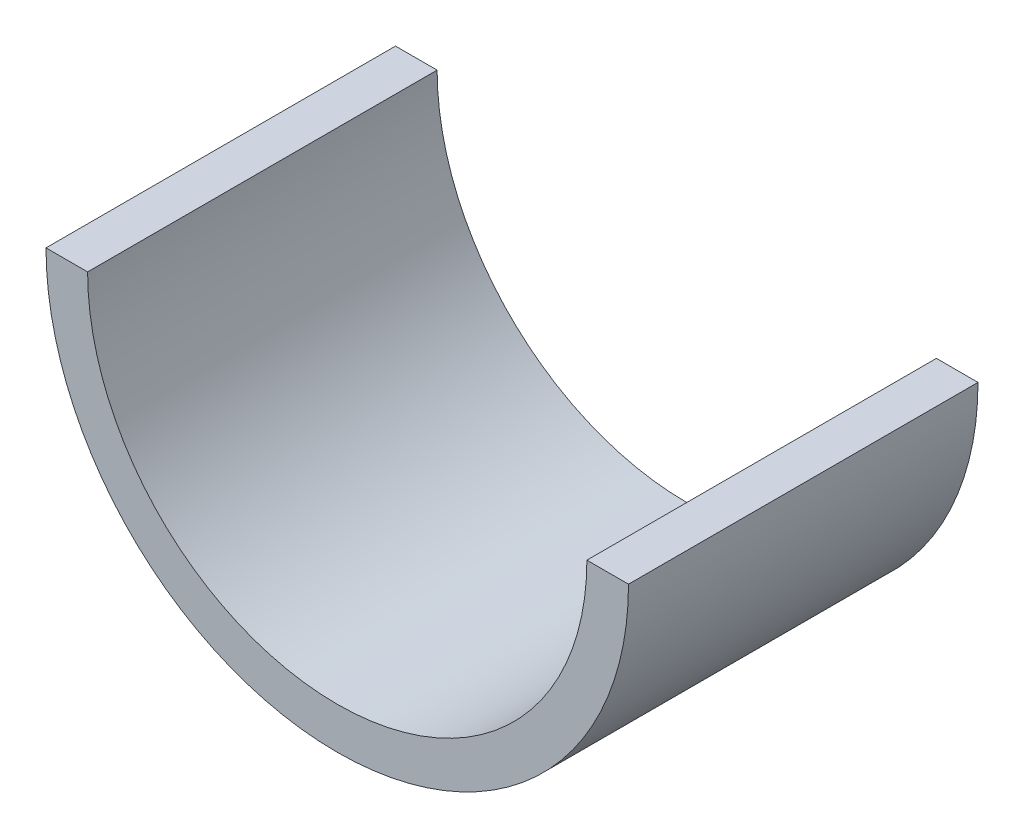
ISO-10303-21;
HEADER;
FILE_DESCRIPTION(('STEP AP214'),'2;1');
FILE_NAME('part.step','',(''),(''),'','','');
FILE_SCHEMA(('AUTOMOTIVE_DESIGN { 1 0 10303 214 1 1 1 1 }'));
ENDSEC;
DATA;
#1=APPLICATION_CONTEXT('core data for automotive mechanical design processes');
#2=APPLICATION_PROTOCOL_DEFINITION('international standard','automotive_design',2000,#1);
#3=PRODUCT_CONTEXT('',#1,'mechanical');
#4=PRODUCT('Part','Part','',(#3));
#5=PRODUCT_RELATED_PRODUCT_CATEGORY('part','',(#4));
#6=PRODUCT_DEFINITION_FORMATION('','',#4);
#7=PRODUCT_DEFINITION_CONTEXT('part definition',#1,'design');
#8=PRODUCT_DEFINITION('design','',#6,#7);
#9=PRODUCT_DEFINITION_SHAPE('','',#8);
#10=(LENGTH_UNIT() NAMED_UNIT(*) SI_UNIT(.MILLI.,.METRE.));
#11=(NAMED_UNIT(*) PLANE_ANGLE_UNIT() SI_UNIT($,.RADIAN.));
#12=(NAMED_UNIT(*) SI_UNIT($,.STERADIAN.) SOLID_ANGLE_UNIT());
#13=UNCERTAINTY_MEASURE_WITH_UNIT(LENGTH_MEASURE(1.E-05),#10,'distance_accuracy_value','');
#14=(GEOMETRIC_REPRESENTATION_CONTEXT(3) GLOBAL_UNCERTAINTY_ASSIGNED_CONTEXT((#13)) GLOBAL_UNIT_ASSIGNED_CONTEXT((#10,
#11,#12)) REPRESENTATION_CONTEXT('',''));
#15=CARTESIAN_POINT('',(0.,0.,0.));
#16=DIRECTION('',(0.,0.,1.));
#17=DIRECTION('',(1.,0.,0.));
#18=AXIS2_PLACEMENT_3D('',#15,#16,#17);
#19=CARTESIAN_POINT('',(0.,0.,42.));
#20=DIRECTION('',(0.,1.,0.));
#21=DIRECTION('',(0.,0.,1.));
#22=AXIS2_PLACEMENT_3D('',#19,#20,#21);
#23=PLANE('',#22);
#24=DIRECTION('',(1.,0.,0.));
#25=VECTOR('',#24,1.);
#26=CARTESIAN_POINT('',(0.,0.,0.));
#27=LINE('',#26,#25);
#28=CARTESIAN_POINT('',(-35.,0.,0.));
#29=VERTEX_POINT('',#28);
#30=CARTESIAN_POINT('',(-30.,0.,0.));
#31=VERTEX_POINT('',#30);
#32=EDGE_CURVE('E108',#29,#31,#27,.T.);
#33=ORIENTED_EDGE('',*,*,#32,.F.);
#34=DIRECTION('',(0.,0.,-1.));
#35=VECTOR('',#34,1.);
#36=CARTESIAN_POINT('',(-35.,0.,42.));
#37=LINE('',#36,#35);
#38=CARTESIAN_POINT('',(-35.,0.,42.));
#39=VERTEX_POINT('',#38);
#40=EDGE_CURVE('E11',#39,#29,#37,.T.);
#41=ORIENTED_EDGE('',*,*,#40,.F.);
#42=DIRECTION('',(1.,0.,0.));
#43=VECTOR('',#42,1.);
#44=CARTESIAN_POINT('',(0.,0.,42.));
#45=LINE('',#44,#43);
#46=CARTESIAN_POINT('',(-30.,0.,42.));
#47=VERTEX_POINT('',#46);
#48=EDGE_CURVE('E90',#39,#47,#45,.T.);
#49=ORIENTED_EDGE('',*,*,#48,.T.);
#50=DIRECTION('',(0.,0.,-1.));
#51=VECTOR('',#50,1.);
#52=CARTESIAN_POINT('',(-30.,0.,42.));
#53=LINE('',#52,#51);
#54=EDGE_CURVE('E58',#47,#31,#53,.T.);
#55=ORIENTED_EDGE('',*,*,#54,.T.);
#56=EDGE_LOOP('',(#33,#41,#49,#55));
#57=FACE_BOUND('',#56,.T.);
#58=ADVANCED_FACE('F41',(#57),#23,.T.);
#59=CARTESIAN_POINT('',(0.,0.,42.));
#60=DIRECTION('',(0.,0.,-1.));
#61=DIRECTION('',(-1.,0.,0.));
#62=AXIS2_PLACEMENT_3D('',#59,#60,#61);
#63=CYLINDRICAL_SURFACE('',#62,35.);
#64=CARTESIAN_POINT('',(0.,0.,0.));
#65=DIRECTION('',(0.,0.,1.));
#66=DIRECTION('',(1.,0.,0.));
#67=AXIS2_PLACEMENT_3D('',#64,#65,#66);
#68=CIRCLE('',#67,35.);
#69=CARTESIAN_POINT('',(35.,0.,0.));
#70=VERTEX_POINT('',#69);
#71=EDGE_CURVE('E95',#29,#70,#68,.T.);
#72=ORIENTED_EDGE('',*,*,#71,.T.);
#73=DIRECTION('',(0.,0.,-1.));
#74=VECTOR('',#73,1.);
#75=CARTESIAN_POINT('',(35.,0.,42.));
#76=LINE('',#75,#74);
#77=CARTESIAN_POINT('',(35.,0.,42.));
#78=VERTEX_POINT('',#77);
#79=EDGE_CURVE('E50',#78,#70,#76,.T.);
#80=ORIENTED_EDGE('',*,*,#79,.F.);
#81=CARTESIAN_POINT('',(0.,0.,42.));
#82=DIRECTION('',(0.,0.,1.));
#83=DIRECTION('',(1.,0.,0.));
#84=AXIS2_PLACEMENT_3D('',#81,#82,#83);
#85=CIRCLE('',#84,35.);
#86=EDGE_CURVE('E84',#39,#78,#85,.T.);
#87=ORIENTED_EDGE('',*,*,#86,.F.);
#88=ORIENTED_EDGE('',*,*,#40,.T.);
#89=EDGE_LOOP('',(#72,#80,#87,#88));
#90=FACE_BOUND('',#89,.T.);
#91=ADVANCED_FACE('F43',(#90),#63,.T.);
#92=CARTESIAN_POINT('',(30.,0.,0.));
#93=VERTEX_POINT('',#92);
#94=EDGE_CURVE('E104',#93,#70,#27,.T.);
#95=ORIENTED_EDGE('',*,*,#94,.F.);
#96=DIRECTION('',(0.,0.,-1.));
#97=VECTOR('',#96,1.);
#98=CARTESIAN_POINT('',(30.,0.,42.));
#99=LINE('',#98,#97);
#100=CARTESIAN_POINT('',(30.,0.,42.));
#101=VERTEX_POINT('',#100);
#102=EDGE_CURVE('E71',#101,#93,#99,.T.);
#103=ORIENTED_EDGE('',*,*,#102,.F.);
#104=EDGE_CURVE('E89',#101,#78,#45,.T.);
#105=ORIENTED_EDGE('',*,*,#104,.T.);
#106=ORIENTED_EDGE('',*,*,#79,.T.);
#107=EDGE_LOOP('',(#95,#103,#105,#106));
#108=FACE_BOUND('',#107,.T.);
#109=ADVANCED_FACE('F98',(#108),#23,.T.);
#110=CARTESIAN_POINT('',(0.,0.,42.));
#111=DIRECTION('',(0.,0.,-1.));
#112=DIRECTION('',(-1.,0.,0.));
#113=AXIS2_PLACEMENT_3D('',#110,#111,#112);
#114=CYLINDRICAL_SURFACE('',#113,30.);
#115=CARTESIAN_POINT('',(0.,0.,0.));
#116=DIRECTION('',(0.,0.,1.));
#117=DIRECTION('',(1.,0.,0.));
#118=AXIS2_PLACEMENT_3D('',#115,#116,#117);
#119=CIRCLE('',#118,30.);
#120=EDGE_CURVE('E102',#31,#93,#119,.T.);
#121=ORIENTED_EDGE('',*,*,#120,.F.);
#122=ORIENTED_EDGE('',*,*,#54,.F.);
#123=CARTESIAN_POINT('',(0.,0.,42.));
#124=DIRECTION('',(0.,0.,1.));
#125=DIRECTION('',(1.,0.,0.));
#126=AXIS2_PLACEMENT_3D('',#123,#124,#125);
#127=CIRCLE('',#126,30.);
#128=EDGE_CURVE('E99',#47,#101,#127,.T.);
#129=ORIENTED_EDGE('',*,*,#128,.T.);
#130=ORIENTED_EDGE('',*,*,#102,.T.);
#131=EDGE_LOOP('',(#121,#122,#129,#130));
#132=FACE_BOUND('',#131,.T.);
#133=ADVANCED_FACE('F113',(#132),#114,.F.);
#134=CARTESIAN_POINT('',(0.,0.,42.));
#135=DIRECTION('',(0.,0.,1.));
#136=DIRECTION('',(1.,0.,0.));
#137=AXIS2_PLACEMENT_3D('',#134,#135,#136);
#138=PLANE('',#137);
#139=ORIENTED_EDGE('',*,*,#48,.F.);
#140=ORIENTED_EDGE('',*,*,#86,.T.);
#141=ORIENTED_EDGE('',*,*,#104,.F.);
#142=ORIENTED_EDGE('',*,*,#128,.F.);
#143=EDGE_LOOP('',(#139,#140,#141,#142));
#144=FACE_BOUND('',#143,.T.);
#145=ADVANCED_FACE('F86',(#144),#138,.T.);
#146=CARTESIAN_POINT('',(0.,0.,0.));
#147=DIRECTION('',(0.,0.,1.));
#148=DIRECTION('',(1.,0.,0.));
#149=AXIS2_PLACEMENT_3D('',#146,#147,#148);
#150=PLANE('',#149);
#151=ORIENTED_EDGE('',*,*,#32,.T.);
#152=ORIENTED_EDGE('',*,*,#120,.T.);
#153=ORIENTED_EDGE('',*,*,#94,.T.);
#154=ORIENTED_EDGE('',*,*,#71,.F.);
#155=EDGE_LOOP('',(#151,#152,#153,#154));
#156=FACE_BOUND('',#155,.T.);
#157=ADVANCED_FACE('F112',(#156),#150,.F.);
#158=CLOSED_SHELL('',(#58,#91,#109,#133,#145,#157));
#159=MANIFOLD_SOLID_BREP('B2',#158);
#160=ADVANCED_BREP_SHAPE_REPRESENTATION('',(#18,#159),#14);
#161=SHAPE_DEFINITION_REPRESENTATION(#9,#160);
ENDSEC;
END-ISO-10303-21;
